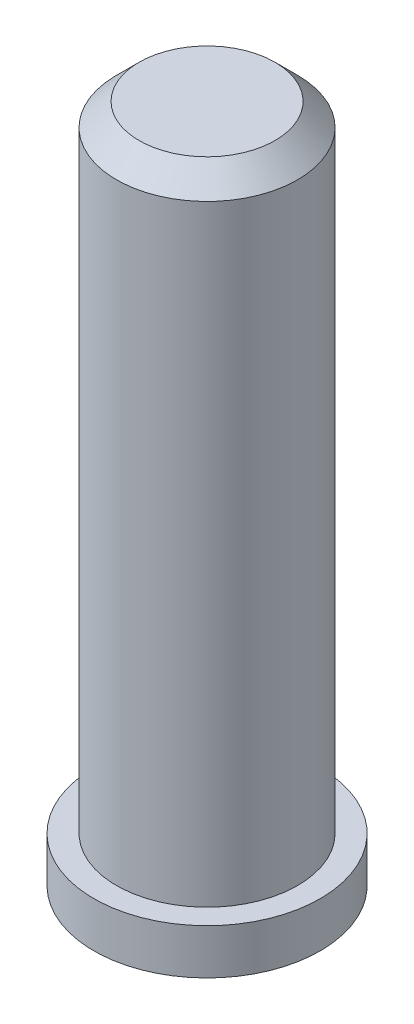
ISO-10303-21;
HEADER;
FILE_DESCRIPTION(('STEP AP214'),'2;1');
FILE_NAME('part.step','',(''),(''),'','','');
FILE_SCHEMA(('AUTOMOTIVE_DESIGN { 1 0 10303 214 1 1 1 1 }'));
ENDSEC;
DATA;
#1=APPLICATION_CONTEXT('core data for automotive mechanical design processes');
#2=APPLICATION_PROTOCOL_DEFINITION('international standard','automotive_design',2000,#1);
#3=PRODUCT_CONTEXT('',#1,'mechanical');
#4=PRODUCT('Part','Part','',(#3));
#5=PRODUCT_RELATED_PRODUCT_CATEGORY('part','',(#4));
#6=PRODUCT_DEFINITION_FORMATION('','',#4);
#7=PRODUCT_DEFINITION_CONTEXT('part definition',#1,'design');
#8=PRODUCT_DEFINITION('design','',#6,#7);
#9=PRODUCT_DEFINITION_SHAPE('','',#8);
#10=(LENGTH_UNIT() NAMED_UNIT(*) SI_UNIT(.MILLI.,.METRE.));
#11=(NAMED_UNIT(*) PLANE_ANGLE_UNIT() SI_UNIT($,.RADIAN.));
#12=(NAMED_UNIT(*) SI_UNIT($,.STERADIAN.) SOLID_ANGLE_UNIT());
#13=UNCERTAINTY_MEASURE_WITH_UNIT(LENGTH_MEASURE(1.E-05),#10,'distance_accuracy_value','');
#14=(GEOMETRIC_REPRESENTATION_CONTEXT(3) GLOBAL_UNCERTAINTY_ASSIGNED_CONTEXT((#13)) GLOBAL_UNIT_ASSIGNED_CONTEXT((#10,
#11,#12)) REPRESENTATION_CONTEXT('',''));
#15=CARTESIAN_POINT('',(0.,0.,0.));
#16=DIRECTION('',(0.,0.,1.));
#17=DIRECTION('',(1.,0.,0.));
#18=AXIS2_PLACEMENT_3D('',#15,#16,#17);
#19=CARTESIAN_POINT('',(0.,-1.,0.));
#20=DIRECTION('',(0.,-1.,0.));
#21=DIRECTION('',(0.,0.,-1.));
#22=AXIS2_PLACEMENT_3D('',#19,#20,#21);
#23=CYLINDRICAL_SURFACE('',#22,4.);
#24=CARTESIAN_POINT('',(0.,28.,0.));
#25=DIRECTION('',(0.,-1.,0.));
#26=DIRECTION('',(0.,0.,-1.));
#27=AXIS2_PLACEMENT_3D('',#24,#25,#26);
#28=CIRCLE('',#27,4.);
#29=CARTESIAN_POINT('',(0.,28.,-4.));
#30=VERTEX_POINT('',#29);
#31=EDGE_CURVE('E53',#30,#30,#28,.T.);
#32=ORIENTED_EDGE('',*,*,#31,.T.);
#33=EDGE_LOOP('',(#32));
#34=FACE_BOUND('',#33,.T.);
#35=CARTESIAN_POINT('',(0.,1.,0.));
#36=DIRECTION('',(0.,-1.,0.));
#37=DIRECTION('',(0.,0.,-1.));
#38=AXIS2_PLACEMENT_3D('',#35,#36,#37);
#39=CIRCLE('',#38,4.);
#40=CARTESIAN_POINT('',(0.,1.,-4.));
#41=VERTEX_POINT('',#40);
#42=EDGE_CURVE('E66',#41,#41,#39,.T.);
#43=ORIENTED_EDGE('',*,*,#42,.F.);
#44=EDGE_LOOP('',(#43));
#45=FACE_BOUND('',#44,.T.);
#46=ADVANCED_FACE('F45',(#34,#45),#23,.T.);
#47=CARTESIAN_POINT('',(0.,29.,0.));
#48=DIRECTION('',(0.,-1.,0.));
#49=DIRECTION('',(0.,0.,-1.));
#50=AXIS2_PLACEMENT_3D('',#47,#48,#49);
#51=PLANE('',#50);
#52=CARTESIAN_POINT('',(0.,29.,0.));
#53=DIRECTION('',(0.,-1.,0.));
#54=DIRECTION('',(0.,0.,-1.));
#55=AXIS2_PLACEMENT_3D('',#52,#53,#54);
#56=CIRCLE('',#55,3.);
#57=CARTESIAN_POINT('',(0.,29.,-3.));
#58=VERTEX_POINT('',#57);
#59=EDGE_CURVE('E10',#58,#58,#56,.F.);
#60=ORIENTED_EDGE('',*,*,#59,.T.);
#61=EDGE_LOOP('',(#60));
#62=FACE_BOUND('',#61,.T.);
#63=ADVANCED_FACE('F73',(#62),#51,.F.);
#64=CARTESIAN_POINT('',(0.,-1.,0.));
#65=DIRECTION('',(0.,-1.,0.));
#66=DIRECTION('',(0.,0.,-1.));
#67=AXIS2_PLACEMENT_3D('',#64,#65,#66);
#68=PLANE('',#67);
#69=CARTESIAN_POINT('',(0.,-1.,0.));
#70=DIRECTION('',(0.,-1.,0.));
#71=DIRECTION('',(0.,0.,-1.));
#72=AXIS2_PLACEMENT_3D('',#69,#70,#71);
#73=CIRCLE('',#72,5.);
#74=CARTESIAN_POINT('',(0.,-1.,-5.));
#75=VERTEX_POINT('',#74);
#76=EDGE_CURVE('E57',#75,#75,#73,.T.);
#77=ORIENTED_EDGE('',*,*,#76,.T.);
#78=EDGE_LOOP('',(#77));
#79=FACE_BOUND('',#78,.T.);
#80=ADVANCED_FACE('F77',(#79),#68,.T.);
#81=CARTESIAN_POINT('',(0.,-1.,0.));
#82=DIRECTION('',(0.,-1.,0.));
#83=DIRECTION('',(0.,0.,-1.));
#84=AXIS2_PLACEMENT_3D('',#81,#82,#83);
#85=CYLINDRICAL_SURFACE('',#84,5.);
#86=CARTESIAN_POINT('',(0.,1.,0.));
#87=DIRECTION('',(0.,-1.,0.));
#88=DIRECTION('',(0.,0.,-1.));
#89=AXIS2_PLACEMENT_3D('',#86,#87,#88);
#90=CIRCLE('',#89,5.);
#91=CARTESIAN_POINT('',(0.,1.,-5.));
#92=VERTEX_POINT('',#91);
#93=EDGE_CURVE('E61',#92,#92,#90,.T.);
#94=ORIENTED_EDGE('',*,*,#93,.T.);
#95=EDGE_LOOP('',(#94));
#96=FACE_BOUND('',#95,.T.);
#97=ORIENTED_EDGE('',*,*,#76,.F.);
#98=EDGE_LOOP('',(#97));
#99=FACE_BOUND('',#98,.T.);
#100=ADVANCED_FACE('F82',(#96,#99),#85,.T.);
#101=CARTESIAN_POINT('',(0.,1.,0.));
#102=DIRECTION('',(0.,-1.,0.));
#103=DIRECTION('',(0.,0.,-1.));
#104=AXIS2_PLACEMENT_3D('',#101,#102,#103);
#105=PLANE('',#104);
#106=ORIENTED_EDGE('',*,*,#93,.F.);
#107=EDGE_LOOP('',(#106));
#108=FACE_BOUND('',#107,.T.);
#109=ORIENTED_EDGE('',*,*,#42,.T.);
#110=EDGE_LOOP('',(#109));
#111=FACE_BOUND('',#110,.T.);
#112=ADVANCED_FACE('F70',(#108,#111),#105,.F.);
#113=CARTESIAN_POINT('',(0.,28.,0.));
#114=DIRECTION('',(0.,-1.,0.));
#115=DIRECTION('',(0.,0.,-1.));
#116=AXIS2_PLACEMENT_3D('',#113,#114,#115);
#117=CONICAL_SURFACE('',#116,4.,0.78539816339745);
#118=ORIENTED_EDGE('',*,*,#59,.F.);
#119=EDGE_LOOP('',(#118));
#120=FACE_BOUND('',#119,.T.);
#121=ORIENTED_EDGE('',*,*,#31,.F.);
#122=EDGE_LOOP('',(#121));
#123=FACE_BOUND('',#122,.T.);
#124=ADVANCED_FACE('F48',(#120,#123),#117,.T.);
#125=CLOSED_SHELL('',(#46,#63,#80,#100,#112,#124));
#126=MANIFOLD_SOLID_BREP('B2',#125);
#127=ADVANCED_BREP_SHAPE_REPRESENTATION('',(#18,#126),#14);
#128=SHAPE_DEFINITION_REPRESENTATION(#9,#127);
ENDSEC;
END-ISO-10303-21;
